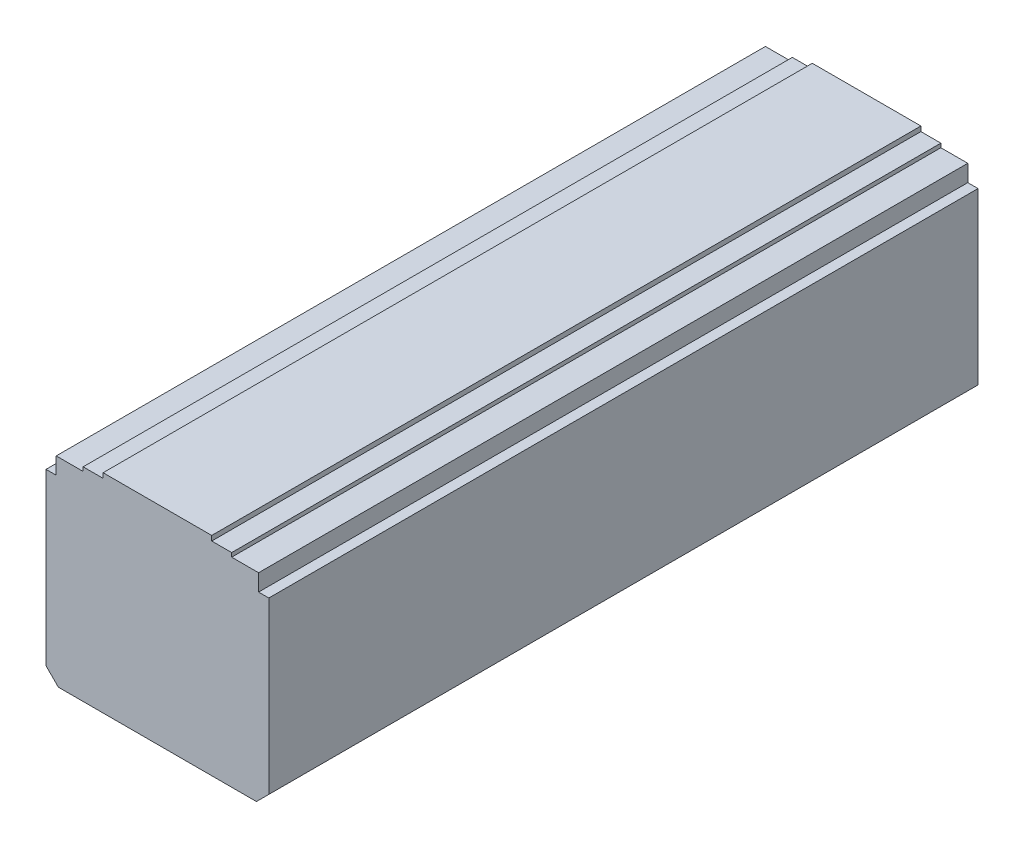
ISO-10303-21;
HEADER;
FILE_DESCRIPTION(('STEP AP214'),'2;1');
FILE_NAME('part.step','',(''),(''),'','','');
FILE_SCHEMA(('AUTOMOTIVE_DESIGN { 1 0 10303 214 1 1 1 1 }'));
ENDSEC;
DATA;
#1=APPLICATION_CONTEXT('core data for automotive mechanical design processes');
#2=APPLICATION_PROTOCOL_DEFINITION('international standard','automotive_design',2000,#1);
#3=PRODUCT_CONTEXT('',#1,'mechanical');
#4=PRODUCT('Part','Part','',(#3));
#5=PRODUCT_RELATED_PRODUCT_CATEGORY('part','',(#4));
#6=PRODUCT_DEFINITION_FORMATION('','',#4);
#7=PRODUCT_DEFINITION_CONTEXT('part definition',#1,'design');
#8=PRODUCT_DEFINITION('design','',#6,#7);
#9=PRODUCT_DEFINITION_SHAPE('','',#8);
#10=(LENGTH_UNIT() NAMED_UNIT(*) SI_UNIT(.MILLI.,.METRE.));
#11=(NAMED_UNIT(*) PLANE_ANGLE_UNIT() SI_UNIT($,.RADIAN.));
#12=(NAMED_UNIT(*) SI_UNIT($,.STERADIAN.) SOLID_ANGLE_UNIT());
#13=UNCERTAINTY_MEASURE_WITH_UNIT(LENGTH_MEASURE(1.E-05),#10,'distance_accuracy_value','');
#14=(GEOMETRIC_REPRESENTATION_CONTEXT(3) GLOBAL_UNCERTAINTY_ASSIGNED_CONTEXT((#13)) GLOBAL_UNIT_ASSIGNED_CONTEXT((#10,
#11,#12)) REPRESENTATION_CONTEXT('',''));
#15=CARTESIAN_POINT('',(0.,0.,0.));
#16=DIRECTION('',(0.,0.,1.));
#17=DIRECTION('',(1.,0.,0.));
#18=AXIS2_PLACEMENT_3D('',#15,#16,#17);
#19=CARTESIAN_POINT('',(-50.,-419.95,2098.));
#20=DIRECTION('',(0.,0.,1.));
#21=DIRECTION('',(1.,0.,0.));
#22=AXIS2_PLACEMENT_3D('',#19,#20,#21);
#23=PLANE('',#22);
#24=DIRECTION('',(-1.,0.,0.));
#25=VECTOR('',#24,1.);
#26=CARTESIAN_POINT('',(-118.,-295.,2098.));
#27=LINE('',#26,#25);
#28=CARTESIAN_POINT('',(-118.,-295.,2098.));
#29=VERTEX_POINT('',#28);
#30=CARTESIAN_POINT('',(-143.,-295.,2098.));
#31=VERTEX_POINT('',#30);
#32=EDGE_CURVE('E11',#29,#31,#27,.T.);
#33=ORIENTED_EDGE('',*,*,#32,.T.);
#34=DIRECTION('',(0.,-1.,0.));
#35=VECTOR('',#34,1.);
#36=CARTESIAN_POINT('',(-143.,-295.,2098.));
#37=LINE('',#36,#35);
#38=CARTESIAN_POINT('',(-143.,-300.,2098.));
#39=VERTEX_POINT('',#38);
#40=EDGE_CURVE('E27',#31,#39,#37,.T.);
#41=ORIENTED_EDGE('',*,*,#40,.T.);
#42=DIRECTION('',(-1.,0.,0.));
#43=VECTOR('',#42,1.);
#44=CARTESIAN_POINT('',(-143.,-300.,2098.));
#45=LINE('',#44,#43);
#46=CARTESIAN_POINT('',(-176.7,-300.,2098.));
#47=VERTEX_POINT('',#46);
#48=EDGE_CURVE('E219',#39,#47,#45,.T.);
#49=ORIENTED_EDGE('',*,*,#48,.T.);
#50=DIRECTION('',(0.,-1.,0.));
#51=VECTOR('',#50,1.);
#52=CARTESIAN_POINT('',(-176.7,-300.,2098.));
#53=LINE('',#52,#51);
#54=CARTESIAN_POINT('',(-176.7,-321.,2098.));
#55=VERTEX_POINT('',#54);
#56=EDGE_CURVE('E222',#47,#55,#53,.T.);
#57=ORIENTED_EDGE('',*,*,#56,.T.);
#58=DIRECTION('',(-1.,0.,0.));
#59=VECTOR('',#58,1.);
#60=CARTESIAN_POINT('',(-176.7,-321.,2098.));
#61=LINE('',#60,#59);
#62=CARTESIAN_POINT('',(-189.5,-321.,2098.));
#63=VERTEX_POINT('',#62);
#64=EDGE_CURVE('E244',#55,#63,#61,.T.);
#65=ORIENTED_EDGE('',*,*,#64,.T.);
#66=DIRECTION('',(0.,-1.,0.));
#67=VECTOR('',#66,1.);
#68=CARTESIAN_POINT('',(-189.5,-321.,2098.));
#69=LINE('',#68,#67);
#70=CARTESIAN_POINT('',(-189.5,-534.,2098.));
#71=VERTEX_POINT('',#70);
#72=EDGE_CURVE('E241',#63,#71,#69,.T.);
#73=ORIENTED_EDGE('',*,*,#72,.T.);
#74=DIRECTION('',(0.707106781186598,-0.707106781186498,0.));
#75=VECTOR('',#74,1.);
#76=CARTESIAN_POINT('',(-189.5,-534.,2098.));
#77=LINE('',#76,#75);
#78=CARTESIAN_POINT('',(-174.,-549.5,2098.));
#79=VERTEX_POINT('',#78);
#80=EDGE_CURVE('E245',#71,#79,#77,.T.);
#81=ORIENTED_EDGE('',*,*,#80,.T.);
#82=DIRECTION('',(1.,0.,0.));
#83=VECTOR('',#82,1.);
#84=CARTESIAN_POINT('',(-174.,-549.5,2098.));
#85=LINE('',#84,#83);
#86=CARTESIAN_POINT('',(74.,-549.5,2098.));
#87=VERTEX_POINT('',#86);
#88=EDGE_CURVE('E251',#79,#87,#85,.T.);
#89=ORIENTED_EDGE('',*,*,#88,.T.);
#90=DIRECTION('',(0.707106781186598,0.707106781186498,0.));
#91=VECTOR('',#90,1.);
#92=CARTESIAN_POINT('',(74.,-549.5,2098.));
#93=LINE('',#92,#91);
#94=CARTESIAN_POINT('',(89.5,-534.,2098.));
#95=VERTEX_POINT('',#94);
#96=EDGE_CURVE('E292',#87,#95,#93,.T.);
#97=ORIENTED_EDGE('',*,*,#96,.T.);
#98=DIRECTION('',(0.,1.,0.));
#99=VECTOR('',#98,1.);
#100=CARTESIAN_POINT('',(89.5,-534.,2098.));
#101=LINE('',#100,#99);
#102=CARTESIAN_POINT('',(89.5,-321.,2098.));
#103=VERTEX_POINT('',#102);
#104=EDGE_CURVE('E296',#95,#103,#101,.T.);
#105=ORIENTED_EDGE('',*,*,#104,.T.);
#106=DIRECTION('',(-1.,0.,0.));
#107=VECTOR('',#106,1.);
#108=CARTESIAN_POINT('',(89.5,-321.,2098.));
#109=LINE('',#108,#107);
#110=CARTESIAN_POINT('',(76.7,-321.,2098.));
#111=VERTEX_POINT('',#110);
#112=EDGE_CURVE('E293',#103,#111,#109,.T.);
#113=ORIENTED_EDGE('',*,*,#112,.T.);
#114=DIRECTION('',(0.,1.,0.));
#115=VECTOR('',#114,1.);
#116=CARTESIAN_POINT('',(76.7,-321.,2098.));
#117=LINE('',#116,#115);
#118=CARTESIAN_POINT('',(76.7,-300.,2098.));
#119=VERTEX_POINT('',#118);
#120=EDGE_CURVE('E235',#111,#119,#117,.T.);
#121=ORIENTED_EDGE('',*,*,#120,.T.);
#122=DIRECTION('',(-1.,0.,0.));
#123=VECTOR('',#122,1.);
#124=CARTESIAN_POINT('',(76.7,-300.,2098.));
#125=LINE('',#124,#123);
#126=CARTESIAN_POINT('',(43.,-300.,2098.));
#127=VERTEX_POINT('',#126);
#128=EDGE_CURVE('E232',#119,#127,#125,.T.);
#129=ORIENTED_EDGE('',*,*,#128,.T.);
#130=DIRECTION('',(0.,1.,0.));
#131=VECTOR('',#130,1.);
#132=CARTESIAN_POINT('',(43.,-300.,2098.));
#133=LINE('',#132,#131);
#134=CARTESIAN_POINT('',(43.,-295.,2098.));
#135=VERTEX_POINT('',#134);
#136=EDGE_CURVE('E236',#127,#135,#133,.T.);
#137=ORIENTED_EDGE('',*,*,#136,.T.);
#138=DIRECTION('',(-1.,0.,0.));
#139=VECTOR('',#138,1.);
#140=CARTESIAN_POINT('',(43.,-295.,2098.));
#141=LINE('',#140,#139);
#142=CARTESIAN_POINT('',(18.,-295.,2098.));
#143=VERTEX_POINT('',#142);
#144=EDGE_CURVE('E185',#135,#143,#141,.T.);
#145=ORIENTED_EDGE('',*,*,#144,.T.);
#146=DIRECTION('',(0.,1.,0.));
#147=VECTOR('',#146,1.);
#148=CARTESIAN_POINT('',(18.,-295.,2098.));
#149=LINE('',#148,#147);
#150=CARTESIAN_POINT('',(18.,-288.9,2098.));
#151=VERTEX_POINT('',#150);
#152=EDGE_CURVE('E180',#143,#151,#149,.T.);
#153=ORIENTED_EDGE('',*,*,#152,.T.);
#154=DIRECTION('',(-1.,0.,0.));
#155=VECTOR('',#154,1.);
#156=CARTESIAN_POINT('',(18.,-288.9,2098.));
#157=LINE('',#156,#155);
#158=CARTESIAN_POINT('',(-118.,-288.9,2098.));
#159=VERTEX_POINT('',#158);
#160=EDGE_CURVE('E170',#151,#159,#157,.T.);
#161=ORIENTED_EDGE('',*,*,#160,.T.);
#162=DIRECTION('',(0.,-1.,0.));
#163=VECTOR('',#162,1.);
#164=CARTESIAN_POINT('',(-118.,-288.9,2098.));
#165=LINE('',#164,#163);
#166=EDGE_CURVE('E181',#159,#29,#165,.T.);
#167=ORIENTED_EDGE('',*,*,#166,.T.);
#168=EDGE_LOOP('',(#33,#41,#49,#57,#65,#73,#81,#89,#97,#105,#113,#121,#129,#137,#145,#153,#161,#167));
#169=FACE_BOUND('',#168,.T.);
#170=ADVANCED_FACE('F17',(#169),#23,.T.);
#171=CARTESIAN_POINT('',(-118.,-288.9,2098.));
#172=DIRECTION('',(-1.,0.,0.));
#173=DIRECTION('',(0.,-1.,0.));
#174=AXIS2_PLACEMENT_3D('',#171,#172,#173);
#175=PLANE('',#174);
#176=DIRECTION('',(0.,0.,-1.));
#177=VECTOR('',#176,1.);
#178=CARTESIAN_POINT('',(-118.,-288.9,2098.));
#179=LINE('',#178,#177);
#180=CARTESIAN_POINT('',(-118.,-288.9,1210.));
#181=VERTEX_POINT('',#180);
#182=EDGE_CURVE('E178',#159,#181,#179,.T.);
#183=ORIENTED_EDGE('',*,*,#182,.T.);
#184=DIRECTION('',(0.,-1.,0.));
#185=VECTOR('',#184,1.);
#186=CARTESIAN_POINT('',(-118.,-288.9,1210.));
#187=LINE('',#186,#185);
#188=CARTESIAN_POINT('',(-118.,-295.,1210.));
#189=VERTEX_POINT('',#188);
#190=EDGE_CURVE('E279',#181,#189,#187,.T.);
#191=ORIENTED_EDGE('',*,*,#190,.T.);
#192=DIRECTION('',(0.,0.,-1.));
#193=VECTOR('',#192,1.);
#194=CARTESIAN_POINT('',(-118.,-295.,2098.));
#195=LINE('',#194,#193);
#196=EDGE_CURVE('E257',#29,#189,#195,.T.);
#197=ORIENTED_EDGE('',*,*,#196,.F.);
#198=ORIENTED_EDGE('',*,*,#166,.F.);
#199=EDGE_LOOP('',(#183,#191,#197,#198));
#200=FACE_BOUND('',#199,.T.);
#201=ADVANCED_FACE('F385',(#200),#175,.T.);
#202=CARTESIAN_POINT('',(-118.,-295.,2098.));
#203=DIRECTION('',(0.,1.,0.));
#204=DIRECTION('',(0.,0.,-1.));
#205=AXIS2_PLACEMENT_3D('',#202,#203,#204);
#206=PLANE('',#205);
#207=ORIENTED_EDGE('',*,*,#196,.T.);
#208=DIRECTION('',(-1.,0.,0.));
#209=VECTOR('',#208,1.);
#210=CARTESIAN_POINT('',(-118.,-295.,1210.));
#211=LINE('',#210,#209);
#212=CARTESIAN_POINT('',(-143.,-295.,1210.));
#213=VERTEX_POINT('',#212);
#214=EDGE_CURVE('E225',#189,#213,#211,.T.);
#215=ORIENTED_EDGE('',*,*,#214,.T.);
#216=DIRECTION('',(0.,0.,-1.));
#217=VECTOR('',#216,1.);
#218=CARTESIAN_POINT('',(-143.,-295.,2098.));
#219=LINE('',#218,#217);
#220=EDGE_CURVE('E223',#31,#213,#219,.T.);
#221=ORIENTED_EDGE('',*,*,#220,.F.);
#222=ORIENTED_EDGE('',*,*,#32,.F.);
#223=EDGE_LOOP('',(#207,#215,#221,#222));
#224=FACE_BOUND('',#223,.T.);
#225=ADVANCED_FACE('F389',(#224),#206,.T.);
#226=CARTESIAN_POINT('',(-143.,-295.,2098.));
#227=DIRECTION('',(-1.,0.,0.));
#228=DIRECTION('',(0.,-1.,0.));
#229=AXIS2_PLACEMENT_3D('',#226,#227,#228);
#230=PLANE('',#229);
#231=ORIENTED_EDGE('',*,*,#220,.T.);
#232=DIRECTION('',(0.,-1.,0.));
#233=VECTOR('',#232,1.);
#234=CARTESIAN_POINT('',(-143.,-295.,1210.));
#235=LINE('',#234,#233);
#236=CARTESIAN_POINT('',(-143.,-300.,1210.));
#237=VERTEX_POINT('',#236);
#238=EDGE_CURVE('E226',#213,#237,#235,.T.);
#239=ORIENTED_EDGE('',*,*,#238,.T.);
#240=DIRECTION('',(0.,0.,-1.));
#241=VECTOR('',#240,1.);
#242=CARTESIAN_POINT('',(-143.,-300.,2098.));
#243=LINE('',#242,#241);
#244=EDGE_CURVE('E237',#39,#237,#243,.T.);
#245=ORIENTED_EDGE('',*,*,#244,.F.);
#246=ORIENTED_EDGE('',*,*,#40,.F.);
#247=EDGE_LOOP('',(#231,#239,#245,#246));
#248=FACE_BOUND('',#247,.T.);
#249=ADVANCED_FACE('F352',(#248),#230,.T.);
#250=CARTESIAN_POINT('',(-143.,-300.,2098.));
#251=DIRECTION('',(0.,1.,0.));
#252=DIRECTION('',(0.,0.,-1.));
#253=AXIS2_PLACEMENT_3D('',#250,#251,#252);
#254=PLANE('',#253);
#255=ORIENTED_EDGE('',*,*,#244,.T.);
#256=DIRECTION('',(-1.,0.,0.));
#257=VECTOR('',#256,1.);
#258=CARTESIAN_POINT('',(-143.,-300.,1210.));
#259=LINE('',#258,#257);
#260=CARTESIAN_POINT('',(-176.7,-300.,1210.));
#261=VERTEX_POINT('',#260);
#262=EDGE_CURVE('E212',#237,#261,#259,.T.);
#263=ORIENTED_EDGE('',*,*,#262,.T.);
#264=DIRECTION('',(0.,0.,-1.));
#265=VECTOR('',#264,1.);
#266=CARTESIAN_POINT('',(-176.7,-300.,2098.));
#267=LINE('',#266,#265);
#268=EDGE_CURVE('E210',#47,#261,#267,.T.);
#269=ORIENTED_EDGE('',*,*,#268,.F.);
#270=ORIENTED_EDGE('',*,*,#48,.F.);
#271=EDGE_LOOP('',(#255,#263,#269,#270));
#272=FACE_BOUND('',#271,.T.);
#273=ADVANCED_FACE('F356',(#272),#254,.T.);
#274=CARTESIAN_POINT('',(-176.7,-300.,2098.));
#275=DIRECTION('',(-1.,0.,0.));
#276=DIRECTION('',(0.,-1.,0.));
#277=AXIS2_PLACEMENT_3D('',#274,#275,#276);
#278=PLANE('',#277);
#279=ORIENTED_EDGE('',*,*,#268,.T.);
#280=DIRECTION('',(0.,-1.,0.));
#281=VECTOR('',#280,1.);
#282=CARTESIAN_POINT('',(-176.7,-300.,1210.));
#283=LINE('',#282,#281);
#284=CARTESIAN_POINT('',(-176.7,-321.,1210.));
#285=VERTEX_POINT('',#284);
#286=EDGE_CURVE('E213',#261,#285,#283,.T.);
#287=ORIENTED_EDGE('',*,*,#286,.T.);
#288=DIRECTION('',(0.,0.,-1.));
#289=VECTOR('',#288,1.);
#290=CARTESIAN_POINT('',(-176.7,-321.,2098.));
#291=LINE('',#290,#289);
#292=EDGE_CURVE('E275',#55,#285,#291,.T.);
#293=ORIENTED_EDGE('',*,*,#292,.F.);
#294=ORIENTED_EDGE('',*,*,#56,.F.);
#295=EDGE_LOOP('',(#279,#287,#293,#294));
#296=FACE_BOUND('',#295,.T.);
#297=ADVANCED_FACE('F359',(#296),#278,.T.);
#298=CARTESIAN_POINT('',(-176.7,-321.,2098.));
#299=DIRECTION('',(0.,1.,0.));
#300=DIRECTION('',(0.,0.,-1.));
#301=AXIS2_PLACEMENT_3D('',#298,#299,#300);
#302=PLANE('',#301);
#303=ORIENTED_EDGE('',*,*,#292,.T.);
#304=DIRECTION('',(-1.,0.,0.));
#305=VECTOR('',#304,1.);
#306=CARTESIAN_POINT('',(-176.7,-321.,1210.));
#307=LINE('',#306,#305);
#308=CARTESIAN_POINT('',(-189.5,-321.,1210.));
#309=VERTEX_POINT('',#308);
#310=EDGE_CURVE('E248',#285,#309,#307,.T.);
#311=ORIENTED_EDGE('',*,*,#310,.T.);
#312=DIRECTION('',(0.,0.,-1.));
#313=VECTOR('',#312,1.);
#314=CARTESIAN_POINT('',(-189.5,-321.,2098.));
#315=LINE('',#314,#313);
#316=EDGE_CURVE('E144',#63,#309,#315,.T.);
#317=ORIENTED_EDGE('',*,*,#316,.F.);
#318=ORIENTED_EDGE('',*,*,#64,.F.);
#319=EDGE_LOOP('',(#303,#311,#317,#318));
#320=FACE_BOUND('',#319,.T.);
#321=ADVANCED_FACE('F363',(#320),#302,.T.);
#322=CARTESIAN_POINT('',(-189.5,-321.,2098.));
#323=DIRECTION('',(-1.,0.,0.));
#324=DIRECTION('',(0.,-1.,0.));
#325=AXIS2_PLACEMENT_3D('',#322,#323,#324);
#326=PLANE('',#325);
#327=ORIENTED_EDGE('',*,*,#316,.T.);
#328=DIRECTION('',(0.,-1.,0.));
#329=VECTOR('',#328,1.);
#330=CARTESIAN_POINT('',(-189.5,-321.,1210.));
#331=LINE('',#330,#329);
#332=CARTESIAN_POINT('',(-189.5,-534.,1210.));
#333=VERTEX_POINT('',#332);
#334=EDGE_CURVE('E208',#309,#333,#331,.T.);
#335=ORIENTED_EDGE('',*,*,#334,.T.);
#336=DIRECTION('',(0.,0.,-1.));
#337=VECTOR('',#336,1.);
#338=CARTESIAN_POINT('',(-189.5,-534.,2098.));
#339=LINE('',#338,#337);
#340=EDGE_CURVE('E151',#71,#333,#339,.T.);
#341=ORIENTED_EDGE('',*,*,#340,.F.);
#342=ORIENTED_EDGE('',*,*,#72,.F.);
#343=EDGE_LOOP('',(#327,#335,#341,#342));
#344=FACE_BOUND('',#343,.T.);
#345=ADVANCED_FACE('F370',(#344),#326,.T.);
#346=CARTESIAN_POINT('',(-189.5,-534.,2098.));
#347=DIRECTION('',(-0.707106781186498,-0.707106781186598,0.));
#348=DIRECTION('',(0.,0.,1.));
#349=AXIS2_PLACEMENT_3D('',#346,#347,#348);
#350=PLANE('',#349);
#351=ORIENTED_EDGE('',*,*,#340,.T.);
#352=DIRECTION('',(0.707106781186598,-0.707106781186498,0.));
#353=VECTOR('',#352,1.);
#354=CARTESIAN_POINT('',(-189.5,-534.,1210.));
#355=LINE('',#354,#353);
#356=CARTESIAN_POINT('',(-174.,-549.5,1210.));
#357=VERTEX_POINT('',#356);
#358=EDGE_CURVE('E209',#333,#357,#355,.T.);
#359=ORIENTED_EDGE('',*,*,#358,.T.);
#360=DIRECTION('',(0.,0.,-1.));
#361=VECTOR('',#360,1.);
#362=CARTESIAN_POINT('',(-174.,-549.5,2098.));
#363=LINE('',#362,#361);
#364=EDGE_CURVE('E325',#79,#357,#363,.T.);
#365=ORIENTED_EDGE('',*,*,#364,.F.);
#366=ORIENTED_EDGE('',*,*,#80,.F.);
#367=EDGE_LOOP('',(#351,#359,#365,#366));
#368=FACE_BOUND('',#367,.T.);
#369=ADVANCED_FACE('F372',(#368),#350,.T.);
#370=CARTESIAN_POINT('',(-174.,-549.5,2098.));
#371=DIRECTION('',(0.,-1.,0.));
#372=DIRECTION('',(1.,0.,0.));
#373=AXIS2_PLACEMENT_3D('',#370,#371,#372);
#374=PLANE('',#373);
#375=ORIENTED_EDGE('',*,*,#364,.T.);
#376=DIRECTION('',(1.,0.,0.));
#377=VECTOR('',#376,1.);
#378=CARTESIAN_POINT('',(-174.,-549.5,1210.));
#379=LINE('',#378,#377);
#380=CARTESIAN_POINT('',(74.,-549.5,1210.));
#381=VERTEX_POINT('',#380);
#382=EDGE_CURVE('E228',#357,#381,#379,.T.);
#383=ORIENTED_EDGE('',*,*,#382,.T.);
#384=DIRECTION('',(0.,0.,-1.));
#385=VECTOR('',#384,1.);
#386=CARTESIAN_POINT('',(74.,-549.5,2098.));
#387=LINE('',#386,#385);
#388=EDGE_CURVE('E217',#87,#381,#387,.T.);
#389=ORIENTED_EDGE('',*,*,#388,.F.);
#390=ORIENTED_EDGE('',*,*,#88,.F.);
#391=EDGE_LOOP('',(#375,#383,#389,#390));
#392=FACE_BOUND('',#391,.T.);
#393=ADVANCED_FACE('F379',(#392),#374,.T.);
#394=CARTESIAN_POINT('',(74.,-549.5,2098.));
#395=DIRECTION('',(0.707106781186498,-0.707106781186598,0.));
#396=DIRECTION('',(0.,0.,-1.));
#397=AXIS2_PLACEMENT_3D('',#394,#395,#396);
#398=PLANE('',#397);
#399=ORIENTED_EDGE('',*,*,#388,.T.);
#400=DIRECTION('',(0.707106781186598,0.707106781186498,0.));
#401=VECTOR('',#400,1.);
#402=CARTESIAN_POINT('',(74.,-549.5,1210.));
#403=LINE('',#402,#401);
#404=CARTESIAN_POINT('',(89.5,-534.,1210.));
#405=VERTEX_POINT('',#404);
#406=EDGE_CURVE('E214',#381,#405,#403,.T.);
#407=ORIENTED_EDGE('',*,*,#406,.T.);
#408=DIRECTION('',(0.,0.,-1.));
#409=VECTOR('',#408,1.);
#410=CARTESIAN_POINT('',(89.5,-534.,2098.));
#411=LINE('',#410,#409);
#412=EDGE_CURVE('E218',#95,#405,#411,.T.);
#413=ORIENTED_EDGE('',*,*,#412,.F.);
#414=ORIENTED_EDGE('',*,*,#96,.F.);
#415=EDGE_LOOP('',(#399,#407,#413,#414));
#416=FACE_BOUND('',#415,.T.);
#417=ADVANCED_FACE('F415',(#416),#398,.T.);
#418=CARTESIAN_POINT('',(89.5,-534.,2098.));
#419=DIRECTION('',(1.,0.,0.));
#420=DIRECTION('',(0.,0.,1.));
#421=AXIS2_PLACEMENT_3D('',#418,#419,#420);
#422=PLANE('',#421);
#423=ORIENTED_EDGE('',*,*,#412,.T.);
#424=DIRECTION('',(0.,1.,0.));
#425=VECTOR('',#424,1.);
#426=CARTESIAN_POINT('',(89.5,-534.,1210.));
#427=LINE('',#426,#425);
#428=CARTESIAN_POINT('',(89.5,-321.,1210.));
#429=VERTEX_POINT('',#428);
#430=EDGE_CURVE('E280',#405,#429,#427,.T.);
#431=ORIENTED_EDGE('',*,*,#430,.T.);
#432=DIRECTION('',(0.,0.,-1.));
#433=VECTOR('',#432,1.);
#434=CARTESIAN_POINT('',(89.5,-321.,2098.));
#435=LINE('',#434,#433);
#436=EDGE_CURVE('E283',#103,#429,#435,.T.);
#437=ORIENTED_EDGE('',*,*,#436,.F.);
#438=ORIENTED_EDGE('',*,*,#104,.F.);
#439=EDGE_LOOP('',(#423,#431,#437,#438));
#440=FACE_BOUND('',#439,.T.);
#441=ADVANCED_FACE('F398',(#440),#422,.T.);
#442=CARTESIAN_POINT('',(89.5,-321.,2098.));
#443=DIRECTION('',(0.,1.,0.));
#444=DIRECTION('',(0.,0.,-1.));
#445=AXIS2_PLACEMENT_3D('',#442,#443,#444);
#446=PLANE('',#445);
#447=ORIENTED_EDGE('',*,*,#436,.T.);
#448=DIRECTION('',(-1.,0.,0.));
#449=VECTOR('',#448,1.);
#450=CARTESIAN_POINT('',(89.5,-321.,1210.));
#451=LINE('',#450,#449);
#452=CARTESIAN_POINT('',(76.7,-321.,1210.));
#453=VERTEX_POINT('',#452);
#454=EDGE_CURVE('E299',#429,#453,#451,.T.);
#455=ORIENTED_EDGE('',*,*,#454,.T.);
#456=DIRECTION('',(0.,0.,-1.));
#457=VECTOR('',#456,1.);
#458=CARTESIAN_POINT('',(76.7,-321.,2098.));
#459=LINE('',#458,#457);
#460=EDGE_CURVE('E297',#111,#453,#459,.T.);
#461=ORIENTED_EDGE('',*,*,#460,.F.);
#462=ORIENTED_EDGE('',*,*,#112,.F.);
#463=EDGE_LOOP('',(#447,#455,#461,#462));
#464=FACE_BOUND('',#463,.T.);
#465=ADVANCED_FACE('F394',(#464),#446,.T.);
#466=CARTESIAN_POINT('',(76.7,-321.,2098.));
#467=DIRECTION('',(1.,0.,0.));
#468=DIRECTION('',(0.,0.,1.));
#469=AXIS2_PLACEMENT_3D('',#466,#467,#468);
#470=PLANE('',#469);
#471=ORIENTED_EDGE('',*,*,#460,.T.);
#472=DIRECTION('',(0.,1.,0.));
#473=VECTOR('',#472,1.);
#474=CARTESIAN_POINT('',(76.7,-321.,1210.));
#475=LINE('',#474,#473);
#476=CARTESIAN_POINT('',(76.7,-300.,1210.));
#477=VERTEX_POINT('',#476);
#478=EDGE_CURVE('E272',#453,#477,#475,.T.);
#479=ORIENTED_EDGE('',*,*,#478,.T.);
#480=DIRECTION('',(0.,0.,-1.));
#481=VECTOR('',#480,1.);
#482=CARTESIAN_POINT('',(76.7,-300.,2098.));
#483=LINE('',#482,#481);
#484=EDGE_CURVE('E313',#119,#477,#483,.T.);
#485=ORIENTED_EDGE('',*,*,#484,.F.);
#486=ORIENTED_EDGE('',*,*,#120,.F.);
#487=EDGE_LOOP('',(#471,#479,#485,#486));
#488=FACE_BOUND('',#487,.T.);
#489=ADVANCED_FACE('F397',(#488),#470,.T.);
#490=CARTESIAN_POINT('',(76.7,-300.,2098.));
#491=DIRECTION('',(0.,1.,0.));
#492=DIRECTION('',(0.,0.,-1.));
#493=AXIS2_PLACEMENT_3D('',#490,#491,#492);
#494=PLANE('',#493);
#495=ORIENTED_EDGE('',*,*,#484,.T.);
#496=DIRECTION('',(-1.,0.,0.));
#497=VECTOR('',#496,1.);
#498=CARTESIAN_POINT('',(76.7,-300.,1210.));
#499=LINE('',#498,#497);
#500=CARTESIAN_POINT('',(43.,-300.,1210.));
#501=VERTEX_POINT('',#500);
#502=EDGE_CURVE('E286',#477,#501,#499,.T.);
#503=ORIENTED_EDGE('',*,*,#502,.T.);
#504=DIRECTION('',(0.,0.,-1.));
#505=VECTOR('',#504,1.);
#506=CARTESIAN_POINT('',(43.,-300.,2098.));
#507=LINE('',#506,#505);
#508=EDGE_CURVE('E284',#127,#501,#507,.T.);
#509=ORIENTED_EDGE('',*,*,#508,.F.);
#510=ORIENTED_EDGE('',*,*,#128,.F.);
#511=EDGE_LOOP('',(#495,#503,#509,#510));
#512=FACE_BOUND('',#511,.T.);
#513=ADVANCED_FACE('F441',(#512),#494,.T.);
#514=CARTESIAN_POINT('',(43.,-300.,2098.));
#515=DIRECTION('',(1.,0.,0.));
#516=DIRECTION('',(0.,0.,1.));
#517=AXIS2_PLACEMENT_3D('',#514,#515,#516);
#518=PLANE('',#517);
#519=ORIENTED_EDGE('',*,*,#508,.T.);
#520=DIRECTION('',(0.,1.,0.));
#521=VECTOR('',#520,1.);
#522=CARTESIAN_POINT('',(43.,-300.,1210.));
#523=LINE('',#522,#521);
#524=CARTESIAN_POINT('',(43.,-295.,1210.));
#525=VERTEX_POINT('',#524);
#526=EDGE_CURVE('E254',#501,#525,#523,.T.);
#527=ORIENTED_EDGE('',*,*,#526,.T.);
#528=DIRECTION('',(0.,0.,-1.));
#529=VECTOR('',#528,1.);
#530=CARTESIAN_POINT('',(43.,-295.,2098.));
#531=LINE('',#530,#529);
#532=EDGE_CURVE('E252',#135,#525,#531,.T.);
#533=ORIENTED_EDGE('',*,*,#532,.F.);
#534=ORIENTED_EDGE('',*,*,#136,.F.);
#535=EDGE_LOOP('',(#519,#527,#533,#534));
#536=FACE_BOUND('',#535,.T.);
#537=ADVANCED_FACE('F19',(#536),#518,.T.);
#538=CARTESIAN_POINT('',(43.,-295.,2098.));
#539=DIRECTION('',(0.,1.,0.));
#540=DIRECTION('',(0.,0.,-1.));
#541=AXIS2_PLACEMENT_3D('',#538,#539,#540);
#542=PLANE('',#541);
#543=ORIENTED_EDGE('',*,*,#532,.T.);
#544=DIRECTION('',(-1.,0.,0.));
#545=VECTOR('',#544,1.);
#546=CARTESIAN_POINT('',(43.,-295.,1210.));
#547=LINE('',#546,#545);
#548=CARTESIAN_POINT('',(18.,-295.,1210.));
#549=VERTEX_POINT('',#548);
#550=EDGE_CURVE('E240',#525,#549,#547,.T.);
#551=ORIENTED_EDGE('',*,*,#550,.T.);
#552=DIRECTION('',(0.,0.,-1.));
#553=VECTOR('',#552,1.);
#554=CARTESIAN_POINT('',(18.,-295.,2098.));
#555=LINE('',#554,#553);
#556=EDGE_CURVE('E195',#143,#549,#555,.T.);
#557=ORIENTED_EDGE('',*,*,#556,.F.);
#558=ORIENTED_EDGE('',*,*,#144,.F.);
#559=EDGE_LOOP('',(#543,#551,#557,#558));
#560=FACE_BOUND('',#559,.T.);
#561=ADVANCED_FACE('F402',(#560),#542,.T.);
#562=CARTESIAN_POINT('',(18.,-295.,2098.));
#563=DIRECTION('',(1.,0.,0.));
#564=DIRECTION('',(0.,0.,1.));
#565=AXIS2_PLACEMENT_3D('',#562,#563,#564);
#566=PLANE('',#565);
#567=ORIENTED_EDGE('',*,*,#556,.T.);
#568=DIRECTION('',(0.,1.,0.));
#569=VECTOR('',#568,1.);
#570=CARTESIAN_POINT('',(18.,-295.,1210.));
#571=LINE('',#570,#569);
#572=CARTESIAN_POINT('',(18.,-288.9,1210.));
#573=VERTEX_POINT('',#572);
#574=EDGE_CURVE('E191',#549,#573,#571,.T.);
#575=ORIENTED_EDGE('',*,*,#574,.T.);
#576=DIRECTION('',(0.,0.,-1.));
#577=VECTOR('',#576,1.);
#578=CARTESIAN_POINT('',(18.,-288.9,2098.));
#579=LINE('',#578,#577);
#580=EDGE_CURVE('E175',#151,#573,#579,.T.);
#581=ORIENTED_EDGE('',*,*,#580,.F.);
#582=ORIENTED_EDGE('',*,*,#152,.F.);
#583=EDGE_LOOP('',(#567,#575,#581,#582));
#584=FACE_BOUND('',#583,.T.);
#585=ADVANCED_FACE('F189',(#584),#566,.T.);
#586=CARTESIAN_POINT('',(18.,-288.9,2098.));
#587=DIRECTION('',(0.,1.,0.));
#588=DIRECTION('',(0.,0.,-1.));
#589=AXIS2_PLACEMENT_3D('',#586,#587,#588);
#590=PLANE('',#589);
#591=ORIENTED_EDGE('',*,*,#580,.T.);
#592=DIRECTION('',(-1.,0.,0.));
#593=VECTOR('',#592,1.);
#594=CARTESIAN_POINT('',(18.,-288.9,1210.));
#595=LINE('',#594,#593);
#596=EDGE_CURVE('E193',#573,#181,#595,.T.);
#597=ORIENTED_EDGE('',*,*,#596,.T.);
#598=ORIENTED_EDGE('',*,*,#182,.F.);
#599=ORIENTED_EDGE('',*,*,#160,.F.);
#600=EDGE_LOOP('',(#591,#597,#598,#599));
#601=FACE_BOUND('',#600,.T.);
#602=ADVANCED_FACE('F172',(#601),#590,.T.);
#603=CARTESIAN_POINT('',(-50.,-419.95,1210.));
#604=DIRECTION('',(0.,0.,1.));
#605=DIRECTION('',(1.,0.,0.));
#606=AXIS2_PLACEMENT_3D('',#603,#604,#605);
#607=PLANE('',#606);
#608=ORIENTED_EDGE('',*,*,#596,.F.);
#609=ORIENTED_EDGE('',*,*,#574,.F.);
#610=ORIENTED_EDGE('',*,*,#550,.F.);
#611=ORIENTED_EDGE('',*,*,#526,.F.);
#612=ORIENTED_EDGE('',*,*,#502,.F.);
#613=ORIENTED_EDGE('',*,*,#478,.F.);
#614=ORIENTED_EDGE('',*,*,#454,.F.);
#615=ORIENTED_EDGE('',*,*,#430,.F.);
#616=ORIENTED_EDGE('',*,*,#406,.F.);
#617=ORIENTED_EDGE('',*,*,#382,.F.);
#618=ORIENTED_EDGE('',*,*,#358,.F.);
#619=ORIENTED_EDGE('',*,*,#334,.F.);
#620=ORIENTED_EDGE('',*,*,#310,.F.);
#621=ORIENTED_EDGE('',*,*,#286,.F.);
#622=ORIENTED_EDGE('',*,*,#262,.F.);
#623=ORIENTED_EDGE('',*,*,#238,.F.);
#624=ORIENTED_EDGE('',*,*,#214,.F.);
#625=ORIENTED_EDGE('',*,*,#190,.F.);
#626=EDGE_LOOP('',(#608,#609,#610,#611,#612,#613,#614,#615,#616,#617,#618,#619,#620,#621,#622,
#623,#624,#625));
#627=FACE_BOUND('',#626,.T.);
#628=CARTESIAN_POINT('',(-50.,-419.95,1210.));
#629=DIRECTION('',(0.,0.,-1.));
#630=DIRECTION('',(-1.,0.,0.));
#631=AXIS2_PLACEMENT_3D('',#628,#629,#630);
#632=CIRCLE('',#631,117.5);
#633=CARTESIAN_POINT('',(-167.5,-419.95,1210.));
#634=VERTEX_POINT('',#633);
#635=CARTESIAN_POINT('',(67.5,-419.95,1210.));
#636=VERTEX_POINT('',#635);
#637=EDGE_CURVE('E287',#634,#636,#632,.T.);
#638=ORIENTED_EDGE('',*,*,#637,.F.);
#639=CARTESIAN_POINT('',(-50.,-419.95,1210.));
#640=DIRECTION('',(0.,0.,-1.));
#641=DIRECTION('',(1.,0.,0.));
#642=AXIS2_PLACEMENT_3D('',#639,#640,#641);
#643=CIRCLE('',#642,117.5);
#644=EDGE_CURVE('E302',#636,#634,#643,.T.);
#645=ORIENTED_EDGE('',*,*,#644,.F.);
#646=EDGE_LOOP('',(#638,#645));
#647=FACE_BOUND('',#646,.T.);
#648=ADVANCED_FACE('F367',(#627,#647),#607,.F.);
#649=CARTESIAN_POINT('',(-50.,-419.95,1210.));
#650=DIRECTION('',(0.,0.,-1.));
#651=DIRECTION('',(1.,0.,0.));
#652=AXIS2_PLACEMENT_3D('',#649,#650,#651);
#653=CYLINDRICAL_SURFACE('',#652,117.5);
#654=DIRECTION('',(0.,0.,1.));
#655=VECTOR('',#654,1.);
#656=CARTESIAN_POINT('',(-167.5,-419.95,1210.));
#657=LINE('',#656,#655);
#658=CARTESIAN_POINT('',(-167.5,-419.95,1225.));
#659=VERTEX_POINT('',#658);
#660=EDGE_CURVE('E197',#634,#659,#657,.T.);
#661=ORIENTED_EDGE('',*,*,#660,.T.);
#662=CARTESIAN_POINT('',(-50.,-419.95,1225.));
#663=DIRECTION('',(0.,0.,-1.));
#664=DIRECTION('',(1.,0.,0.));
#665=AXIS2_PLACEMENT_3D('',#662,#663,#664);
#666=CIRCLE('',#665,117.5);
#667=CARTESIAN_POINT('',(67.5,-419.95,1225.));
#668=VERTEX_POINT('',#667);
#669=EDGE_CURVE('E262',#668,#659,#666,.T.);
#670=ORIENTED_EDGE('',*,*,#669,.F.);
#671=DIRECTION('',(0.,0.,1.));
#672=VECTOR('',#671,1.);
#673=CARTESIAN_POINT('',(67.5,-419.95,1210.));
#674=LINE('',#673,#672);
#675=EDGE_CURVE('E289',#636,#668,#674,.T.);
#676=ORIENTED_EDGE('',*,*,#675,.F.);
#677=ORIENTED_EDGE('',*,*,#644,.T.);
#678=EDGE_LOOP('',(#661,#670,#676,#677));
#679=FACE_BOUND('',#678,.T.);
#680=ADVANCED_FACE('F410',(#679),#653,.F.);
#681=CARTESIAN_POINT('',(-50.,-419.95,1210.));
#682=DIRECTION('',(0.,0.,-1.));
#683=DIRECTION('',(1.,0.,0.));
#684=AXIS2_PLACEMENT_3D('',#681,#682,#683);
#685=CYLINDRICAL_SURFACE('',#684,117.5);
#686=ORIENTED_EDGE('',*,*,#675,.T.);
#687=CARTESIAN_POINT('',(-50.,-419.95,1225.));
#688=DIRECTION('',(0.,0.,-1.));
#689=DIRECTION('',(-1.,0.,0.));
#690=AXIS2_PLACEMENT_3D('',#687,#688,#689);
#691=CIRCLE('',#690,117.5);
#692=EDGE_CURVE('E21',#659,#668,#691,.T.);
#693=ORIENTED_EDGE('',*,*,#692,.F.);
#694=ORIENTED_EDGE('',*,*,#660,.F.);
#695=ORIENTED_EDGE('',*,*,#637,.T.);
#696=EDGE_LOOP('',(#686,#693,#694,#695));
#697=FACE_BOUND('',#696,.T.);
#698=ADVANCED_FACE('F413',(#697),#685,.F.);
#699=CARTESIAN_POINT('',(-50.,-419.95,1225.));
#700=DIRECTION('',(0.,0.,-1.));
#701=DIRECTION('',(0.,1.,0.));
#702=AXIS2_PLACEMENT_3D('',#699,#700,#701);
#703=PLANE('',#702);
#704=ORIENTED_EDGE('',*,*,#692,.T.);
#705=ORIENTED_EDGE('',*,*,#669,.T.);
#706=EDGE_LOOP('',(#704,#705));
#707=FACE_BOUND('',#706,.T.);
#708=CARTESIAN_POINT('',(-50.,-419.95,1225.));
#709=DIRECTION('',(0.,0.,-1.));
#710=DIRECTION('',(-1.,0.,0.));
#711=AXIS2_PLACEMENT_3D('',#708,#709,#710);
#712=CIRCLE('',#711,101.);
#713=CARTESIAN_POINT('',(-151.,-419.95,1225.));
#714=VERTEX_POINT('',#713);
#715=CARTESIAN_POINT('',(51.,-419.95,1225.));
#716=VERTEX_POINT('',#715);
#717=EDGE_CURVE('E204',#714,#716,#712,.T.);
#718=ORIENTED_EDGE('',*,*,#717,.F.);
#719=CARTESIAN_POINT('',(-50.,-419.95,1225.));
#720=DIRECTION('',(0.,0.,-1.));
#721=DIRECTION('',(1.,0.,0.));
#722=AXIS2_PLACEMENT_3D('',#719,#720,#721);
#723=CIRCLE('',#722,101.);
#724=EDGE_CURVE('E259',#716,#714,#723,.T.);
#725=ORIENTED_EDGE('',*,*,#724,.F.);
#726=EDGE_LOOP('',(#718,#725));
#727=FACE_BOUND('',#726,.T.);
#728=ADVANCED_FACE('F407',(#707,#727),#703,.T.);
#729=CARTESIAN_POINT('',(-50.,-419.95,1210.));
#730=DIRECTION('',(0.,0.,-1.));
#731=DIRECTION('',(1.,0.,0.));
#732=AXIS2_PLACEMENT_3D('',#729,#730,#731);
#733=CYLINDRICAL_SURFACE('',#732,101.);
#734=DIRECTION('',(0.,0.,1.));
#735=VECTOR('',#734,1.);
#736=CARTESIAN_POINT('',(-151.,-419.95,1225.));
#737=LINE('',#736,#735);
#738=CARTESIAN_POINT('',(-151.,-419.95,1510.));
#739=VERTEX_POINT('',#738);
#740=EDGE_CURVE('E260',#714,#739,#737,.T.);
#741=ORIENTED_EDGE('',*,*,#740,.T.);
#742=CARTESIAN_POINT('',(-50.,-419.95,1510.));
#743=DIRECTION('',(0.,0.,-1.));
#744=DIRECTION('',(1.,0.,0.));
#745=AXIS2_PLACEMENT_3D('',#742,#743,#744);
#746=CIRCLE('',#745,101.);
#747=CARTESIAN_POINT('',(51.,-419.95,1510.));
#748=VERTEX_POINT('',#747);
#749=EDGE_CURVE('E201',#748,#739,#746,.T.);
#750=ORIENTED_EDGE('',*,*,#749,.F.);
#751=DIRECTION('',(0.,0.,1.));
#752=VECTOR('',#751,1.);
#753=CARTESIAN_POINT('',(51.,-419.95,1225.));
#754=LINE('',#753,#752);
#755=EDGE_CURVE('E206',#716,#748,#754,.T.);
#756=ORIENTED_EDGE('',*,*,#755,.F.);
#757=ORIENTED_EDGE('',*,*,#724,.T.);
#758=EDGE_LOOP('',(#741,#750,#756,#757));
#759=FACE_BOUND('',#758,.T.);
#760=ADVANCED_FACE('F403',(#759),#733,.F.);
#761=CARTESIAN_POINT('',(-50.,-419.95,1210.));
#762=DIRECTION('',(0.,0.,-1.));
#763=DIRECTION('',(1.,0.,0.));
#764=AXIS2_PLACEMENT_3D('',#761,#762,#763);
#765=CYLINDRICAL_SURFACE('',#764,101.);
#766=ORIENTED_EDGE('',*,*,#755,.T.);
#767=CARTESIAN_POINT('',(-50.,-419.95,1510.));
#768=DIRECTION('',(0.,0.,-1.));
#769=DIRECTION('',(-1.,0.,0.));
#770=AXIS2_PLACEMENT_3D('',#767,#768,#769);
#771=CIRCLE('',#770,101.);
#772=EDGE_CURVE('E202',#739,#748,#771,.T.);
#773=ORIENTED_EDGE('',*,*,#772,.F.);
#774=ORIENTED_EDGE('',*,*,#740,.F.);
#775=ORIENTED_EDGE('',*,*,#717,.T.);
#776=EDGE_LOOP('',(#766,#773,#774,#775));
#777=FACE_BOUND('',#776,.T.);
#778=ADVANCED_FACE('F406',(#777),#765,.F.);
#779=CARTESIAN_POINT('',(-50.,-419.95,1510.));
#780=DIRECTION('',(0.,0.,-1.));
#781=DIRECTION('',(0.,1.,0.));
#782=AXIS2_PLACEMENT_3D('',#779,#780,#781);
#783=PLANE('',#782);
#784=ORIENTED_EDGE('',*,*,#772,.T.);
#785=ORIENTED_EDGE('',*,*,#749,.T.);
#786=EDGE_LOOP('',(#784,#785));
#787=FACE_BOUND('',#786,.T.);
#788=ADVANCED_FACE('F453',(#787),#783,.T.);
#789=CLOSED_SHELL('',(#170,#201,#225,#249,#273,#297,#321,#345,#369,#393,#417,#441,#465,#489,
#513,#537,#561,#585,#602,#648,#680,#698,#728,#760,#778,#788));
#790=MANIFOLD_SOLID_BREP('B1',#789);
#791=ADVANCED_BREP_SHAPE_REPRESENTATION('',(#18,#790),#14);
#792=SHAPE_DEFINITION_REPRESENTATION(#9,#791);
ENDSEC;
END-ISO-10303-21;
